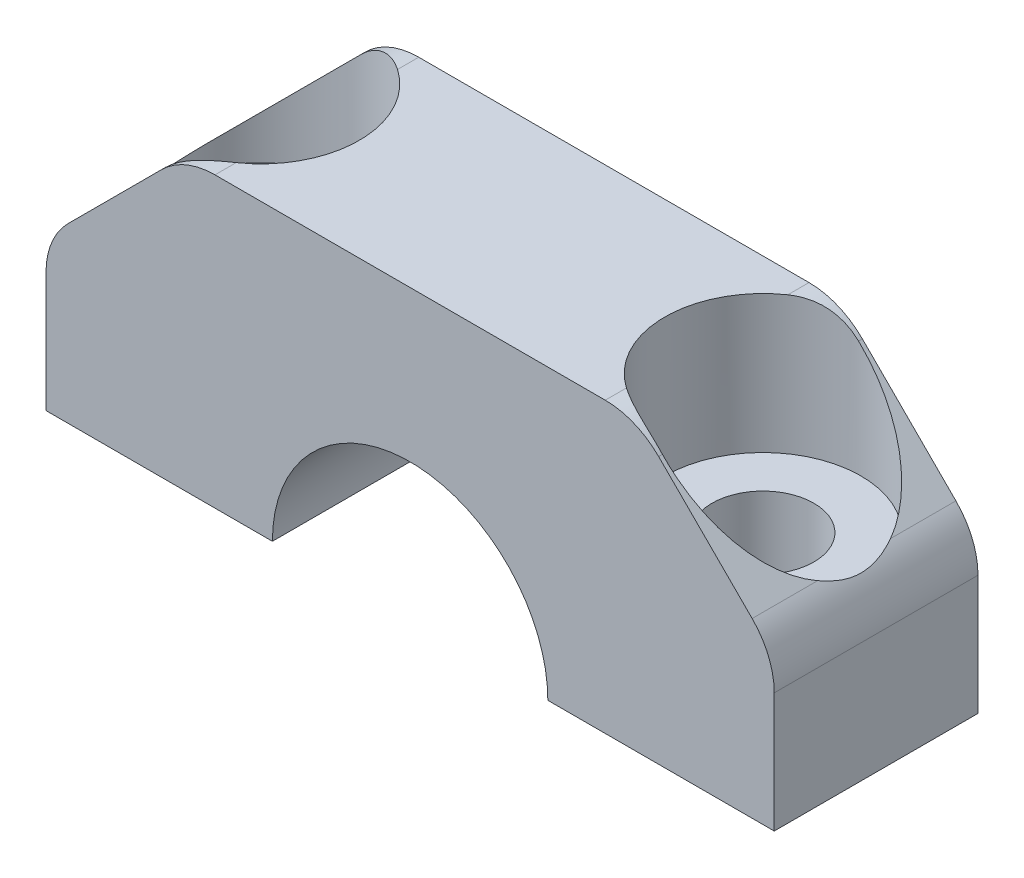
ISO-10303-21;
HEADER;
FILE_DESCRIPTION(('STEP AP214'),'2;1');
FILE_NAME('part.step','',(''),(''),'','','');
FILE_SCHEMA(('AUTOMOTIVE_DESIGN { 1 0 10303 214 1 1 1 1 }'));
ENDSEC;
DATA;
#1=APPLICATION_CONTEXT('core data for automotive mechanical design processes');
#2=APPLICATION_PROTOCOL_DEFINITION('international standard','automotive_design',2000,#1);
#3=PRODUCT_CONTEXT('',#1,'mechanical');
#4=PRODUCT('Part','Part','',(#3));
#5=PRODUCT_RELATED_PRODUCT_CATEGORY('part','',(#4));
#6=PRODUCT_DEFINITION_FORMATION('','',#4);
#7=PRODUCT_DEFINITION_CONTEXT('part definition',#1,'design');
#8=PRODUCT_DEFINITION('design','',#6,#7);
#9=PRODUCT_DEFINITION_SHAPE('','',#8);
#10=(LENGTH_UNIT() NAMED_UNIT(*) SI_UNIT(.MILLI.,.METRE.));
#11=(NAMED_UNIT(*) PLANE_ANGLE_UNIT() SI_UNIT($,.RADIAN.));
#12=(NAMED_UNIT(*) SI_UNIT($,.STERADIAN.) SOLID_ANGLE_UNIT());
#13=UNCERTAINTY_MEASURE_WITH_UNIT(LENGTH_MEASURE(1.E-05),#10,'distance_accuracy_value','');
#14=(GEOMETRIC_REPRESENTATION_CONTEXT(3) GLOBAL_UNCERTAINTY_ASSIGNED_CONTEXT((#13)) GLOBAL_UNIT_ASSIGNED_CONTEXT((#10,
#11,#12)) REPRESENTATION_CONTEXT('',''));
#15=CARTESIAN_POINT('',(0.,0.,0.));
#16=DIRECTION('',(0.,0.,1.));
#17=DIRECTION('',(1.,0.,0.));
#18=AXIS2_PLACEMENT_3D('',#15,#16,#17);
#19=CARTESIAN_POINT('',(-12.2555,5.08,0.));
#20=DIRECTION('',(0.707106781186551,-0.707106781186544,0.));
#21=DIRECTION('',(0.707106781186544,0.707106781186551,0.));
#22=AXIS2_PLACEMENT_3D('',#19,#20,#21);
#23=PLANE('',#22);
#24=DIRECTION('',(0.707106781186544,0.707106781186551,0.));
#25=VECTOR('',#24,1.);
#26=CARTESIAN_POINT('',(-12.2555,5.08,0.));
#27=LINE('',#26,#25);
#28=CARTESIAN_POINT('',(-11.5115512242138,5.82394877578617,0.));
#29=VERTEX_POINT('',#28);
#30=CARTESIAN_POINT('',(-8.36394877578622,8.97155122421382,0.));
#31=VERTEX_POINT('',#30);
#32=EDGE_CURVE('E395',#29,#31,#27,.T.);
#33=ORIENTED_EDGE('',*,*,#32,.F.);
#34=DIRECTION('',(0.,0.,1.));
#35=VECTOR('',#34,1.);
#36=CARTESIAN_POINT('',(-11.5115512242138,5.82394877578617,0.));
#37=LINE('',#36,#35);
#38=CARTESIAN_POINT('',(-11.5115512242138,5.82394877578617,2.20322110864283));
#39=VERTEX_POINT('',#38);
#40=EDGE_CURVE('E278',#29,#39,#37,.T.);
#41=ORIENTED_EDGE('',*,*,#40,.T.);
#42=CARTESIAN_POINT('',(-8.4455,8.89000000000004,3.429));
#43=DIRECTION('',(0.707106781186551,-0.707106781186544,0.));
#44=DIRECTION('',(-0.707106781186544,-0.707106781186551,0.));
#45=AXIS2_PLACEMENT_3D('',#42,#43,#44);
#46=ELLIPSE('',#45,4.66973318295598,3.302);
#47=CARTESIAN_POINT('',(-8.36394877578622,8.97155122421382,0.128007210273062));
#48=VERTEX_POINT('',#47);
#49=EDGE_CURVE('E197',#48,#39,#46,.F.);
#50=ORIENTED_EDGE('',*,*,#49,.F.);
#51=DIRECTION('',(0.,0.,1.));
#52=VECTOR('',#51,1.);
#53=CARTESIAN_POINT('',(-8.36394877578622,8.97155122421382,0.));
#54=LINE('',#53,#52);
#55=EDGE_CURVE('E437',#48,#31,#54,.F.);
#56=ORIENTED_EDGE('',*,*,#55,.T.);
#57=EDGE_LOOP('',(#33,#41,#50,#56));
#58=FACE_BOUND('',#57,.T.);
#59=ADVANCED_FACE('F37',(#58),#23,.F.);
#60=CARTESIAN_POINT('',(7.62000000000005,9.7155,0.));
#61=DIRECTION('',(-0.707106781186551,-0.707106781186544,0.));
#62=DIRECTION('',(0.707106781186544,-0.707106781186551,0.));
#63=AXIS2_PLACEMENT_3D('',#60,#61,#62);
#64=PLANE('',#63);
#65=DIRECTION('',(0.707106781186544,-0.707106781186551,0.));
#66=VECTOR('',#65,1.);
#67=CARTESIAN_POINT('',(7.62000000000005,9.7155,6.858));
#68=LINE('',#67,#66);
#69=CARTESIAN_POINT('',(8.36394877578622,8.97155122421382,6.858));
#70=VERTEX_POINT('',#69);
#71=CARTESIAN_POINT('',(11.5115512242138,5.82394877578617,6.858));
#72=VERTEX_POINT('',#71);
#73=EDGE_CURVE('E207',#70,#72,#68,.T.);
#74=ORIENTED_EDGE('',*,*,#73,.T.);
#75=DIRECTION('',(0.,0.,1.));
#76=VECTOR('',#75,1.);
#77=CARTESIAN_POINT('',(11.5115512242138,5.82394877578617,0.));
#78=LINE('',#77,#76);
#79=CARTESIAN_POINT('',(11.5115512242138,5.82394877578617,4.65477889135718));
#80=VERTEX_POINT('',#79);
#81=EDGE_CURVE('E292',#72,#80,#78,.F.);
#82=ORIENTED_EDGE('',*,*,#81,.T.);
#83=CARTESIAN_POINT('',(8.4455,8.89000000000003,3.429));
#84=DIRECTION('',(-0.707106781186551,-0.707106781186544,0.));
#85=DIRECTION('',(0.707106781186544,-0.707106781186551,0.));
#86=AXIS2_PLACEMENT_3D('',#83,#84,#85);
#87=ELLIPSE('',#86,4.66973318295599,3.302);
#88=CARTESIAN_POINT('',(8.36394877578622,8.97155122421382,6.72999278972694));
#89=VERTEX_POINT('',#88);
#90=EDGE_CURVE('E189',#89,#80,#87,.F.);
#91=ORIENTED_EDGE('',*,*,#90,.F.);
#92=DIRECTION('',(0.,0.,1.));
#93=VECTOR('',#92,1.);
#94=CARTESIAN_POINT('',(8.36394877578622,8.97155122421382,0.));
#95=LINE('',#94,#93);
#96=EDGE_CURVE('E199',#89,#70,#95,.T.);
#97=ORIENTED_EDGE('',*,*,#96,.T.);
#98=EDGE_LOOP('',(#74,#82,#91,#97));
#99=FACE_BOUND('',#98,.T.);
#100=ADVANCED_FACE('F305',(#99),#64,.F.);
#101=CARTESIAN_POINT('',(8.4455,9.7155,3.429));
#102=DIRECTION('',(0.,-1.,0.));
#103=DIRECTION('',(0.,0.,-1.));
#104=AXIS2_PLACEMENT_3D('',#101,#102,#103);
#105=CYLINDRICAL_SURFACE('',#104,1.7145);
#106=CARTESIAN_POINT('',(8.4455,0.,3.429));
#107=DIRECTION('',(0.,1.,0.));
#108=DIRECTION('',(0.,0.,1.));
#109=AXIS2_PLACEMENT_3D('',#106,#107,#108);
#110=CIRCLE('',#109,1.7145);
#111=CARTESIAN_POINT('',(8.4455,0.,1.7145));
#112=VERTEX_POINT('',#111);
#113=EDGE_CURVE('E392',#112,#112,#110,.T.);
#114=CARTESIAN_POINT('',(8.4455,5.08,3.429));
#115=DIRECTION('',(0.,1.,0.));
#116=DIRECTION('',(-1.,0.,0.));
#117=AXIS2_PLACEMENT_3D('',#114,#115,#116);
#118=CIRCLE('',#117,1.7145);
#119=CARTESIAN_POINT('',(8.4455,5.08,1.7145));
#120=VERTEX_POINT('',#119);
#121=EDGE_CURVE('E203',#120,#120,#118,.F.);
#122=CARTESIAN_POINT('',(8.4455,0.,1.7145));
#123=CARTESIAN_POINT('',(8.4455,0.0529166666666664,1.7145));
#124=CARTESIAN_POINT('',(8.4455,0.105833333333333,1.7145));
#125=CARTESIAN_POINT('',(8.4455,0.211666666666666,1.7145));
#126=CARTESIAN_POINT('',(8.4455,0.264583333333333,1.7145));
#127=CARTESIAN_POINT('',(8.4455,0.370416666666667,1.7145));
#128=CARTESIAN_POINT('',(8.4455,0.423333333333334,1.7145));
#129=CARTESIAN_POINT('',(8.4455,0.529166666666667,1.7145));
#130=CARTESIAN_POINT('',(8.4455,0.582083333333334,1.7145));
#131=CARTESIAN_POINT('',(8.4455,0.687916666666667,1.7145));
#132=CARTESIAN_POINT('',(8.4455,0.740833333333333,1.7145));
#133=CARTESIAN_POINT('',(8.4455,0.846666666666666,1.7145));
#134=CARTESIAN_POINT('',(8.4455,0.899583333333333,1.7145));
#135=CARTESIAN_POINT('',(8.4455,1.00541666666667,1.7145));
#136=CARTESIAN_POINT('',(8.4455,1.05833333333333,1.7145));
#137=CARTESIAN_POINT('',(8.4455,1.16416666666667,1.7145));
#138=CARTESIAN_POINT('',(8.4455,1.21708333333333,1.7145));
#139=CARTESIAN_POINT('',(8.4455,1.32291666666667,1.7145));
#140=CARTESIAN_POINT('',(8.4455,1.37583333333333,1.7145));
#141=CARTESIAN_POINT('',(8.4455,1.48166666666667,1.7145));
#142=CARTESIAN_POINT('',(8.4455,1.53458333333333,1.7145));
#143=CARTESIAN_POINT('',(8.4455,1.64041666666667,1.7145));
#144=CARTESIAN_POINT('',(8.4455,1.69333333333333,1.7145));
#145=CARTESIAN_POINT('',(8.4455,1.79916666666667,1.7145));
#146=CARTESIAN_POINT('',(8.4455,1.85208333333333,1.7145));
#147=CARTESIAN_POINT('',(8.4455,1.95791666666667,1.7145));
#148=CARTESIAN_POINT('',(8.4455,2.01083333333333,1.7145));
#149=CARTESIAN_POINT('',(8.4455,2.11666666666667,1.7145));
#150=CARTESIAN_POINT('',(8.4455,2.16958333333333,1.7145));
#151=CARTESIAN_POINT('',(8.4455,2.27541666666667,1.7145));
#152=CARTESIAN_POINT('',(8.4455,2.32833333333333,1.7145));
#153=CARTESIAN_POINT('',(8.4455,2.43416666666667,1.7145));
#154=CARTESIAN_POINT('',(8.4455,2.48708333333333,1.7145));
#155=CARTESIAN_POINT('',(8.4455,2.59291666666667,1.7145));
#156=CARTESIAN_POINT('',(8.4455,2.64583333333333,1.7145));
#157=CARTESIAN_POINT('',(8.4455,2.75166666666667,1.7145));
#158=CARTESIAN_POINT('',(8.4455,2.80458333333333,1.7145));
#159=CARTESIAN_POINT('',(8.4455,2.91041666666667,1.7145));
#160=CARTESIAN_POINT('',(8.4455,2.96333333333333,1.7145));
#161=CARTESIAN_POINT('',(8.4455,3.06916666666667,1.7145));
#162=CARTESIAN_POINT('',(8.4455,3.12208333333333,1.7145));
#163=CARTESIAN_POINT('',(8.4455,3.22791666666667,1.7145));
#164=CARTESIAN_POINT('',(8.4455,3.28083333333333,1.7145));
#165=CARTESIAN_POINT('',(8.4455,3.38666666666667,1.7145));
#166=CARTESIAN_POINT('',(8.4455,3.43958333333333,1.7145));
#167=CARTESIAN_POINT('',(8.4455,3.54541666666667,1.7145));
#168=CARTESIAN_POINT('',(8.4455,3.59833333333333,1.7145));
#169=CARTESIAN_POINT('',(8.4455,3.70416666666667,1.7145));
#170=CARTESIAN_POINT('',(8.4455,3.75708333333333,1.7145));
#171=CARTESIAN_POINT('',(8.4455,3.86291666666667,1.7145));
#172=CARTESIAN_POINT('',(8.4455,3.91583333333333,1.7145));
#173=CARTESIAN_POINT('',(8.4455,4.02166666666667,1.7145));
#174=CARTESIAN_POINT('',(8.4455,4.07458333333333,1.7145));
#175=CARTESIAN_POINT('',(8.4455,4.18041666666667,1.7145));
#176=CARTESIAN_POINT('',(8.4455,4.23333333333333,1.7145));
#177=CARTESIAN_POINT('',(8.4455,4.33916666666667,1.7145));
#178=CARTESIAN_POINT('',(8.4455,4.39208333333333,1.7145));
#179=CARTESIAN_POINT('',(8.4455,4.49791666666667,1.7145));
#180=CARTESIAN_POINT('',(8.4455,4.55083333333333,1.7145));
#181=CARTESIAN_POINT('',(8.4455,4.65666666666667,1.7145));
#182=CARTESIAN_POINT('',(8.4455,4.70958333333333,1.7145));
#183=CARTESIAN_POINT('',(8.4455,4.81541666666667,1.7145));
#184=CARTESIAN_POINT('',(8.4455,4.86833333333333,1.7145));
#185=CARTESIAN_POINT('',(8.4455,4.97416666666667,1.7145));
#186=CARTESIAN_POINT('',(8.4455,5.02708333333333,1.7145));
#187=CARTESIAN_POINT('',(8.4455,5.08,1.7145));
#188=B_SPLINE_CURVE_WITH_KNOTS('',3,(#122,#123,#124,#125,#126,#127,#128,#129,#130,#131,#132,
#133,#134,#135,#136,#137,#138,#139,#140,#141,#142,#143,#144,#145,#146,#147,#148,#149,#150,#151,
#152,#153,#154,#155,#156,#157,#158,#159,#160,#161,#162,#163,#164,#165,#166,#167,#168,#169,#170,
#171,#172,#173,#174,#175,#176,#177,#178,#179,#180,#181,#182,#183,#184,#185,#186,#187),
.UNSPECIFIED.,.F.,.F.,(4,2,2,2,2,2,2,2,2,2,2,2,2,2,2,2,2,2,2,2,2,2,2,2,2,2,2,2,2,2,2,2,4),(0.,
0.158749999999999,0.3175,0.476250000000001,0.635,0.793749999999999,0.9525,1.11125,1.27,1.42875,
1.5875,1.74625,1.905,2.06375,2.2225,2.38125,2.54,2.69875,2.8575,3.01625,3.175,3.33375,3.4925,
3.65125,3.81,3.96875,4.1275,4.28625,4.445,4.60375,4.7625,4.92125,5.08),.UNSPECIFIED.);
#189=EDGE_CURVE('BSEAM311',#112,#120,#188,.T.);
#190=ORIENTED_EDGE('',*,*,#113,.F.);
#191=ORIENTED_EDGE('',*,*,#121,.F.);
#192=ORIENTED_EDGE('',*,*,#189,.T.);
#193=ORIENTED_EDGE('',*,*,#189,.F.);
#194=EDGE_LOOP('',(#190,#192,#191,#193));
#195=FACE_BOUND('',#194,.T.);
#196=ADVANCED_FACE('F311',(#195),#105,.F.);
#197=CARTESIAN_POINT('',(-8.4455,9.7155,3.429));
#198=DIRECTION('',(0.,-1.,0.));
#199=DIRECTION('',(0.,0.,-1.));
#200=AXIS2_PLACEMENT_3D('',#197,#198,#199);
#201=CYLINDRICAL_SURFACE('',#200,1.7145);
#202=CARTESIAN_POINT('',(-8.4455,0.,3.429));
#203=DIRECTION('',(0.,1.,0.));
#204=DIRECTION('',(0.,0.,1.));
#205=AXIS2_PLACEMENT_3D('',#202,#203,#204);
#206=CIRCLE('',#205,1.7145);
#207=CARTESIAN_POINT('',(-8.4455,0.,1.7145));
#208=VERTEX_POINT('',#207);
#209=EDGE_CURVE('E383',#208,#208,#206,.T.);
#210=CARTESIAN_POINT('',(-8.4455,5.08,3.429));
#211=DIRECTION('',(0.,1.,0.));
#212=DIRECTION('',(-1.,0.,0.));
#213=AXIS2_PLACEMENT_3D('',#210,#211,#212);
#214=CIRCLE('',#213,1.7145);
#215=CARTESIAN_POINT('',(-8.4455,5.08,1.7145));
#216=VERTEX_POINT('',#215);
#217=EDGE_CURVE('E200',#216,#216,#214,.F.);
#218=CARTESIAN_POINT('',(-8.4455,0.,1.7145));
#219=CARTESIAN_POINT('',(-8.4455,0.0529166666666664,1.7145));
#220=CARTESIAN_POINT('',(-8.4455,0.105833333333333,1.7145));
#221=CARTESIAN_POINT('',(-8.4455,0.211666666666666,1.7145));
#222=CARTESIAN_POINT('',(-8.4455,0.264583333333333,1.7145));
#223=CARTESIAN_POINT('',(-8.4455,0.370416666666666,1.7145));
#224=CARTESIAN_POINT('',(-8.4455,0.423333333333333,1.7145));
#225=CARTESIAN_POINT('',(-8.4455,0.529166666666666,1.7145));
#226=CARTESIAN_POINT('',(-8.4455,0.582083333333333,1.7145));
#227=CARTESIAN_POINT('',(-8.4455,0.687916666666667,1.7145));
#228=CARTESIAN_POINT('',(-8.4455,0.740833333333333,1.7145));
#229=CARTESIAN_POINT('',(-8.4455,0.846666666666666,1.7145));
#230=CARTESIAN_POINT('',(-8.4455,0.899583333333333,1.7145));
#231=CARTESIAN_POINT('',(-8.4455,1.00541666666667,1.7145));
#232=CARTESIAN_POINT('',(-8.4455,1.05833333333333,1.7145));
#233=CARTESIAN_POINT('',(-8.4455,1.16416666666667,1.7145));
#234=CARTESIAN_POINT('',(-8.4455,1.21708333333333,1.7145));
#235=CARTESIAN_POINT('',(-8.4455,1.32291666666667,1.7145));
#236=CARTESIAN_POINT('',(-8.4455,1.37583333333333,1.7145));
#237=CARTESIAN_POINT('',(-8.4455,1.48166666666667,1.7145));
#238=CARTESIAN_POINT('',(-8.4455,1.53458333333333,1.7145));
#239=CARTESIAN_POINT('',(-8.4455,1.64041666666667,1.7145));
#240=CARTESIAN_POINT('',(-8.4455,1.69333333333333,1.7145));
#241=CARTESIAN_POINT('',(-8.4455,1.79916666666667,1.7145));
#242=CARTESIAN_POINT('',(-8.4455,1.85208333333333,1.7145));
#243=CARTESIAN_POINT('',(-8.4455,1.95791666666667,1.7145));
#244=CARTESIAN_POINT('',(-8.4455,2.01083333333333,1.7145));
#245=CARTESIAN_POINT('',(-8.4455,2.11666666666667,1.7145));
#246=CARTESIAN_POINT('',(-8.4455,2.16958333333333,1.7145));
#247=CARTESIAN_POINT('',(-8.4455,2.27541666666667,1.7145));
#248=CARTESIAN_POINT('',(-8.4455,2.32833333333333,1.7145));
#249=CARTESIAN_POINT('',(-8.4455,2.43416666666667,1.7145));
#250=CARTESIAN_POINT('',(-8.4455,2.48708333333333,1.7145));
#251=CARTESIAN_POINT('',(-8.4455,2.59291666666667,1.7145));
#252=CARTESIAN_POINT('',(-8.4455,2.64583333333333,1.7145));
#253=CARTESIAN_POINT('',(-8.4455,2.75166666666667,1.7145));
#254=CARTESIAN_POINT('',(-8.4455,2.80458333333333,1.7145));
#255=CARTESIAN_POINT('',(-8.4455,2.91041666666667,1.7145));
#256=CARTESIAN_POINT('',(-8.4455,2.96333333333333,1.7145));
#257=CARTESIAN_POINT('',(-8.4455,3.06916666666667,1.7145));
#258=CARTESIAN_POINT('',(-8.4455,3.12208333333333,1.7145));
#259=CARTESIAN_POINT('',(-8.4455,3.22791666666667,1.7145));
#260=CARTESIAN_POINT('',(-8.4455,3.28083333333333,1.7145));
#261=CARTESIAN_POINT('',(-8.4455,3.38666666666667,1.7145));
#262=CARTESIAN_POINT('',(-8.4455,3.43958333333333,1.7145));
#263=CARTESIAN_POINT('',(-8.4455,3.54541666666666,1.7145));
#264=CARTESIAN_POINT('',(-8.4455,3.59833333333333,1.7145));
#265=CARTESIAN_POINT('',(-8.4455,3.70416666666667,1.7145));
#266=CARTESIAN_POINT('',(-8.4455,3.75708333333333,1.7145));
#267=CARTESIAN_POINT('',(-8.4455,3.86291666666667,1.7145));
#268=CARTESIAN_POINT('',(-8.4455,3.91583333333333,1.7145));
#269=CARTESIAN_POINT('',(-8.4455,4.02166666666666,1.7145));
#270=CARTESIAN_POINT('',(-8.4455,4.07458333333333,1.7145));
#271=CARTESIAN_POINT('',(-8.4455,4.18041666666667,1.7145));
#272=CARTESIAN_POINT('',(-8.4455,4.23333333333333,1.7145));
#273=CARTESIAN_POINT('',(-8.4455,4.33916666666666,1.7145));
#274=CARTESIAN_POINT('',(-8.4455,4.39208333333333,1.7145));
#275=CARTESIAN_POINT('',(-8.4455,4.49791666666667,1.7145));
#276=CARTESIAN_POINT('',(-8.4455,4.55083333333333,1.7145));
#277=CARTESIAN_POINT('',(-8.4455,4.65666666666666,1.7145));
#278=CARTESIAN_POINT('',(-8.4455,4.70958333333333,1.7145));
#279=CARTESIAN_POINT('',(-8.4455,4.81541666666666,1.7145));
#280=CARTESIAN_POINT('',(-8.4455,4.86833333333333,1.7145));
#281=CARTESIAN_POINT('',(-8.4455,4.97416666666667,1.7145));
#282=CARTESIAN_POINT('',(-8.4455,5.02708333333333,1.7145));
#283=CARTESIAN_POINT('',(-8.4455,5.08,1.7145));
#284=B_SPLINE_CURVE_WITH_KNOTS('',3,(#218,#219,#220,#221,#222,#223,#224,#225,#226,#227,#228,
#229,#230,#231,#232,#233,#234,#235,#236,#237,#238,#239,#240,#241,#242,#243,#244,#245,#246,#247,
#248,#249,#250,#251,#252,#253,#254,#255,#256,#257,#258,#259,#260,#261,#262,#263,#264,#265,#266,
#267,#268,#269,#270,#271,#272,#273,#274,#275,#276,#277,#278,#279,#280,#281,#282,#283),
.UNSPECIFIED.,.F.,.F.,(4,2,2,2,2,2,2,2,2,2,2,2,2,2,2,2,2,2,2,2,2,2,2,2,2,2,2,2,2,2,2,2,4),(0.,
0.158749999999999,0.3175,0.476249999999999,0.635,0.793749999999999,0.9525,1.11125,1.27,1.42875,
1.5875,1.74625,1.905,2.06375,2.2225,2.38125,2.54,2.69875,2.8575,3.01625,3.175,3.33375,3.4925,
3.65125,3.81,3.96875,4.1275,4.28625,4.445,4.60375,4.7625,4.92125,5.08),.UNSPECIFIED.);
#285=EDGE_CURVE('BSEAM317',#208,#216,#284,.T.);
#286=ORIENTED_EDGE('',*,*,#209,.F.);
#287=ORIENTED_EDGE('',*,*,#217,.F.);
#288=ORIENTED_EDGE('',*,*,#285,.T.);
#289=ORIENTED_EDGE('',*,*,#285,.F.);
#290=EDGE_LOOP('',(#286,#288,#287,#289));
#291=FACE_BOUND('',#290,.T.);
#292=ADVANCED_FACE('F317',(#291),#201,.F.);
#293=CARTESIAN_POINT('',(-11.5115512242138,5.82394877578617,4.65477889135717));
#294=VERTEX_POINT('',#293);
#295=CARTESIAN_POINT('',(-8.36394877578622,8.97155122421382,6.72999278972694));
#296=VERTEX_POINT('',#295);
#297=EDGE_CURVE('E196',#294,#296,#46,.F.);
#298=ORIENTED_EDGE('',*,*,#297,.F.);
#299=DIRECTION('',(0.,0.,1.));
#300=VECTOR('',#299,1.);
#301=CARTESIAN_POINT('',(-11.5115512242138,5.82394877578617,0.));
#302=LINE('',#301,#300);
#303=CARTESIAN_POINT('',(-11.5115512242138,5.82394877578617,6.858));
#304=VERTEX_POINT('',#303);
#305=EDGE_CURVE('E280',#294,#304,#302,.T.);
#306=ORIENTED_EDGE('',*,*,#305,.T.);
#307=DIRECTION('',(0.707106781186544,0.707106781186551,0.));
#308=VECTOR('',#307,1.);
#309=CARTESIAN_POINT('',(-12.2555,5.08,6.858));
#310=LINE('',#309,#308);
#311=CARTESIAN_POINT('',(-8.36394877578622,8.97155122421382,6.858));
#312=VERTEX_POINT('',#311);
#313=EDGE_CURVE('E398',#304,#312,#310,.T.);
#314=ORIENTED_EDGE('',*,*,#313,.T.);
#315=DIRECTION('',(0.,0.,1.));
#316=VECTOR('',#315,1.);
#317=CARTESIAN_POINT('',(-8.36394877578622,8.97155122421382,0.));
#318=LINE('',#317,#316);
#319=EDGE_CURVE('E328',#312,#296,#318,.F.);
#320=ORIENTED_EDGE('',*,*,#319,.T.);
#321=EDGE_LOOP('',(#298,#306,#314,#320));
#322=FACE_BOUND('',#321,.T.);
#323=ADVANCED_FACE('F307',(#322),#23,.F.);
#324=CARTESIAN_POINT('',(11.5115512242138,5.82394877578617,2.20322110864282));
#325=VERTEX_POINT('',#324);
#326=CARTESIAN_POINT('',(8.36394877578622,8.97155122421382,0.128007210273062));
#327=VERTEX_POINT('',#326);
#328=EDGE_CURVE('E187',#325,#327,#87,.F.);
#329=ORIENTED_EDGE('',*,*,#328,.F.);
#330=DIRECTION('',(0.,0.,1.));
#331=VECTOR('',#330,1.);
#332=CARTESIAN_POINT('',(11.5115512242138,5.82394877578617,0.));
#333=LINE('',#332,#331);
#334=CARTESIAN_POINT('',(11.5115512242138,5.82394877578617,0.));
#335=VERTEX_POINT('',#334);
#336=EDGE_CURVE('E332',#325,#335,#333,.F.);
#337=ORIENTED_EDGE('',*,*,#336,.T.);
#338=DIRECTION('',(0.707106781186544,-0.707106781186551,0.));
#339=VECTOR('',#338,1.);
#340=CARTESIAN_POINT('',(7.62000000000005,9.7155,0.));
#341=LINE('',#340,#339);
#342=CARTESIAN_POINT('',(8.36394877578622,8.97155122421382,0.));
#343=VERTEX_POINT('',#342);
#344=EDGE_CURVE('E355',#343,#335,#341,.T.);
#345=ORIENTED_EDGE('',*,*,#344,.F.);
#346=DIRECTION('',(0.,0.,1.));
#347=VECTOR('',#346,1.);
#348=CARTESIAN_POINT('',(8.36394877578622,8.97155122421382,0.));
#349=LINE('',#348,#347);
#350=EDGE_CURVE('E210',#343,#327,#349,.T.);
#351=ORIENTED_EDGE('',*,*,#350,.T.);
#352=EDGE_LOOP('',(#329,#337,#345,#351));
#353=FACE_BOUND('',#352,.T.);
#354=ADVANCED_FACE('F314',(#353),#64,.F.);
#355=CARTESIAN_POINT('',(-12.2555,9.7155,6.858));
#356=DIRECTION('',(1.,0.,0.));
#357=DIRECTION('',(0.,1.,0.));
#358=AXIS2_PLACEMENT_3D('',#355,#356,#357);
#359=PLANE('',#358);
#360=DIRECTION('',(0.,-1.,0.));
#361=VECTOR('',#360,1.);
#362=CARTESIAN_POINT('',(-12.2555,9.7155,6.858));
#363=LINE('',#362,#361);
#364=CARTESIAN_POINT('',(-12.2555,4.02789755157235,6.858));
#365=VERTEX_POINT('',#364);
#366=CARTESIAN_POINT('',(-12.2555,0.,6.858));
#367=VERTEX_POINT('',#366);
#368=EDGE_CURVE('E160',#365,#367,#363,.T.);
#369=ORIENTED_EDGE('',*,*,#368,.F.);
#370=DIRECTION('',(0.,0.,1.));
#371=VECTOR('',#370,1.);
#372=CARTESIAN_POINT('',(-12.2555,4.02789755157235,6.858));
#373=LINE('',#372,#371);
#374=CARTESIAN_POINT('',(-12.2555,4.02789755157235,0.));
#375=VERTEX_POINT('',#374);
#376=EDGE_CURVE('E11',#365,#375,#373,.F.);
#377=ORIENTED_EDGE('',*,*,#376,.T.);
#378=DIRECTION('',(0.,-1.,0.));
#379=VECTOR('',#378,1.);
#380=CARTESIAN_POINT('',(-12.2555,9.7155,0.));
#381=LINE('',#380,#379);
#382=CARTESIAN_POINT('',(-12.2555,0.,0.));
#383=VERTEX_POINT('',#382);
#384=EDGE_CURVE('E185',#375,#383,#381,.T.);
#385=ORIENTED_EDGE('',*,*,#384,.T.);
#386=DIRECTION('',(0.,0.,-1.));
#387=VECTOR('',#386,1.);
#388=CARTESIAN_POINT('',(-12.2555,0.,6.858));
#389=LINE('',#388,#387);
#390=EDGE_CURVE('E177',#367,#383,#389,.T.);
#391=ORIENTED_EDGE('',*,*,#390,.F.);
#392=EDGE_LOOP('',(#369,#377,#385,#391));
#393=FACE_BOUND('',#392,.T.);
#394=ADVANCED_FACE('F183',(#393),#359,.F.);
#395=CARTESIAN_POINT('',(-12.2555,0.,6.858));
#396=DIRECTION('',(0.,1.,0.));
#397=DIRECTION('',(0.,0.,1.));
#398=AXIS2_PLACEMENT_3D('',#395,#396,#397);
#399=PLANE('',#398);
#400=ORIENTED_EDGE('',*,*,#209,.T.);
#401=EDGE_LOOP('',(#400));
#402=FACE_BOUND('',#401,.T.);
#403=DIRECTION('',(1.,0.,0.));
#404=VECTOR('',#403,1.);
#405=CARTESIAN_POINT('',(-12.2555,0.,0.));
#406=LINE('',#405,#404);
#407=CARTESIAN_POINT('',(-4.6355,0.,0.));
#408=VERTEX_POINT('',#407);
#409=EDGE_CURVE('E379',#383,#408,#406,.T.);
#410=ORIENTED_EDGE('',*,*,#409,.T.);
#411=DIRECTION('',(0.,0.,-1.));
#412=VECTOR('',#411,1.);
#413=CARTESIAN_POINT('',(-4.6355,0.,6.858));
#414=LINE('',#413,#412);
#415=CARTESIAN_POINT('',(-4.6355,0.,6.858));
#416=VERTEX_POINT('',#415);
#417=EDGE_CURVE('E179',#416,#408,#414,.T.);
#418=ORIENTED_EDGE('',*,*,#417,.F.);
#419=DIRECTION('',(1.,0.,0.));
#420=VECTOR('',#419,1.);
#421=CARTESIAN_POINT('',(-12.2555,0.,6.858));
#422=LINE('',#421,#420);
#423=EDGE_CURVE('E164',#367,#416,#422,.T.);
#424=ORIENTED_EDGE('',*,*,#423,.F.);
#425=ORIENTED_EDGE('',*,*,#390,.T.);
#426=EDGE_LOOP('',(#410,#418,#424,#425));
#427=FACE_BOUND('',#426,.T.);
#428=ADVANCED_FACE('F176',(#402,#427),#399,.F.);
#429=CARTESIAN_POINT('',(0.,0.,6.858));
#430=DIRECTION('',(0.,0.,-1.));
#431=DIRECTION('',(-1.,0.,0.));
#432=AXIS2_PLACEMENT_3D('',#429,#430,#431);
#433=CYLINDRICAL_SURFACE('',#432,4.6355);
#434=CARTESIAN_POINT('',(0.,0.,0.));
#435=DIRECTION('',(0.,0.,-1.));
#436=DIRECTION('',(1.,0.,0.));
#437=AXIS2_PLACEMENT_3D('',#434,#435,#436);
#438=CIRCLE('',#437,4.6355);
#439=CARTESIAN_POINT('',(4.6355,0.,0.));
#440=VERTEX_POINT('',#439);
#441=EDGE_CURVE('E366',#408,#440,#438,.T.);
#442=ORIENTED_EDGE('',*,*,#441,.T.);
#443=DIRECTION('',(0.,0.,-1.));
#444=VECTOR('',#443,1.);
#445=CARTESIAN_POINT('',(4.6355,0.,6.858));
#446=LINE('',#445,#444);
#447=CARTESIAN_POINT('',(4.6355,0.,6.858));
#448=VERTEX_POINT('',#447);
#449=EDGE_CURVE('E191',#448,#440,#446,.T.);
#450=ORIENTED_EDGE('',*,*,#449,.F.);
#451=CARTESIAN_POINT('',(0.,0.,6.858));
#452=DIRECTION('',(0.,0.,-1.));
#453=DIRECTION('',(1.,0.,0.));
#454=AXIS2_PLACEMENT_3D('',#451,#452,#453);
#455=CIRCLE('',#454,4.6355);
#456=EDGE_CURVE('E181',#416,#448,#455,.T.);
#457=ORIENTED_EDGE('',*,*,#456,.F.);
#458=ORIENTED_EDGE('',*,*,#417,.T.);
#459=EDGE_LOOP('',(#442,#450,#457,#458));
#460=FACE_BOUND('',#459,.T.);
#461=ADVANCED_FACE('F448',(#460),#433,.F.);
#462=CARTESIAN_POINT('',(12.2555,0.,6.858));
#463=DIRECTION('',(0.,1.,0.));
#464=DIRECTION('',(0.,0.,1.));
#465=AXIS2_PLACEMENT_3D('',#462,#463,#464);
#466=PLANE('',#465);
#467=ORIENTED_EDGE('',*,*,#113,.T.);
#468=EDGE_LOOP('',(#467));
#469=FACE_BOUND('',#468,.T.);
#470=DIRECTION('',(1.,0.,0.));
#471=VECTOR('',#470,1.);
#472=CARTESIAN_POINT('',(12.2555,0.,0.));
#473=LINE('',#472,#471);
#474=CARTESIAN_POINT('',(12.2555,0.,0.));
#475=VERTEX_POINT('',#474);
#476=EDGE_CURVE('E362',#440,#475,#473,.T.);
#477=ORIENTED_EDGE('',*,*,#476,.T.);
#478=DIRECTION('',(0.,0.,-1.));
#479=VECTOR('',#478,1.);
#480=CARTESIAN_POINT('',(12.2555,0.,6.858));
#481=LINE('',#480,#479);
#482=CARTESIAN_POINT('',(12.2555,0.,6.858));
#483=VERTEX_POINT('',#482);
#484=EDGE_CURVE('E361',#483,#475,#481,.T.);
#485=ORIENTED_EDGE('',*,*,#484,.F.);
#486=DIRECTION('',(1.,0.,0.));
#487=VECTOR('',#486,1.);
#488=CARTESIAN_POINT('',(12.2555,0.,6.858));
#489=LINE('',#488,#487);
#490=EDGE_CURVE('E376',#448,#483,#489,.T.);
#491=ORIENTED_EDGE('',*,*,#490,.F.);
#492=ORIENTED_EDGE('',*,*,#449,.T.);
#493=EDGE_LOOP('',(#477,#485,#491,#492));
#494=FACE_BOUND('',#493,.T.);
#495=ADVANCED_FACE('F375',(#469,#494),#466,.F.);
#496=CARTESIAN_POINT('',(12.2555,9.7155,6.858));
#497=DIRECTION('',(-1.,0.,0.));
#498=DIRECTION('',(0.,-1.,0.));
#499=AXIS2_PLACEMENT_3D('',#496,#497,#498);
#500=PLANE('',#499);
#501=DIRECTION('',(0.,1.,0.));
#502=VECTOR('',#501,1.);
#503=CARTESIAN_POINT('',(12.2555,9.7155,0.));
#504=LINE('',#503,#502);
#505=CARTESIAN_POINT('',(12.2555,4.02789755157235,0.));
#506=VERTEX_POINT('',#505);
#507=EDGE_CURVE('E354',#475,#506,#504,.T.);
#508=ORIENTED_EDGE('',*,*,#507,.T.);
#509=DIRECTION('',(0.,0.,1.));
#510=VECTOR('',#509,1.);
#511=CARTESIAN_POINT('',(12.2555,4.02789755157235,6.858));
#512=LINE('',#511,#510);
#513=CARTESIAN_POINT('',(12.2555,4.02789755157235,6.858));
#514=VERTEX_POINT('',#513);
#515=EDGE_CURVE('E256',#506,#514,#512,.T.);
#516=ORIENTED_EDGE('',*,*,#515,.T.);
#517=DIRECTION('',(0.,1.,0.));
#518=VECTOR('',#517,1.);
#519=CARTESIAN_POINT('',(12.2555,9.7155,6.858));
#520=LINE('',#519,#518);
#521=EDGE_CURVE('E386',#483,#514,#520,.T.);
#522=ORIENTED_EDGE('',*,*,#521,.F.);
#523=ORIENTED_EDGE('',*,*,#484,.T.);
#524=EDGE_LOOP('',(#508,#516,#522,#523));
#525=FACE_BOUND('',#524,.T.);
#526=ADVANCED_FACE('F358',(#525),#500,.F.);
#527=CARTESIAN_POINT('',(-12.2555,9.7155,6.858));
#528=DIRECTION('',(0.,-1.,0.));
#529=DIRECTION('',(0.,0.,-1.));
#530=AXIS2_PLACEMENT_3D('',#527,#528,#529);
#531=PLANE('',#530);
#532=CARTESIAN_POINT('',(8.4455,9.71550000000001,3.429));
#533=DIRECTION('',(0.,1.,0.));
#534=DIRECTION('',(-1.,0.,0.));
#535=AXIS2_PLACEMENT_3D('',#532,#533,#534);
#536=CIRCLE('',#535,3.302);
#537=CARTESIAN_POINT('',(6.56789755157238,9.71550000000001,0.71278700289197));
#538=VERTEX_POINT('',#537);
#539=CARTESIAN_POINT('',(6.56789755157238,9.71550000000001,6.14521299710803));
#540=VERTEX_POINT('',#539);
#541=EDGE_CURVE('E404',#538,#540,#536,.T.);
#542=ORIENTED_EDGE('',*,*,#541,.F.);
#543=DIRECTION('',(0.,0.,1.));
#544=VECTOR('',#543,1.);
#545=CARTESIAN_POINT('',(6.56789755157238,9.7155,6.858));
#546=LINE('',#545,#544);
#547=CARTESIAN_POINT('',(6.56789755157237,9.7155,0.));
#548=VERTEX_POINT('',#547);
#549=EDGE_CURVE('E426',#538,#548,#546,.F.);
#550=ORIENTED_EDGE('',*,*,#549,.T.);
#551=DIRECTION('',(-1.,0.,0.));
#552=VECTOR('',#551,1.);
#553=CARTESIAN_POINT('',(-12.2555,9.7155,0.));
#554=LINE('',#553,#552);
#555=CARTESIAN_POINT('',(-6.56789755157238,9.7155,0.));
#556=VERTEX_POINT('',#555);
#557=EDGE_CURVE('E172',#548,#556,#554,.T.);
#558=ORIENTED_EDGE('',*,*,#557,.T.);
#559=DIRECTION('',(0.,0.,1.));
#560=VECTOR('',#559,1.);
#561=CARTESIAN_POINT('',(-6.56789755157238,9.7155,6.858));
#562=LINE('',#561,#560);
#563=CARTESIAN_POINT('',(-6.56789755157238,9.7155,0.712787002891967));
#564=VERTEX_POINT('',#563);
#565=EDGE_CURVE('E421',#556,#564,#562,.T.);
#566=ORIENTED_EDGE('',*,*,#565,.T.);
#567=CARTESIAN_POINT('',(-8.4455,9.7155,3.429));
#568=DIRECTION('',(0.,1.,0.));
#569=DIRECTION('',(-1.,0.,0.));
#570=AXIS2_PLACEMENT_3D('',#567,#568,#569);
#571=CIRCLE('',#570,3.302);
#572=CARTESIAN_POINT('',(-6.56789755157238,9.7155,6.14521299710803));
#573=VERTEX_POINT('',#572);
#574=EDGE_CURVE('E204',#573,#564,#571,.T.);
#575=ORIENTED_EDGE('',*,*,#574,.F.);
#576=DIRECTION('',(0.,0.,1.));
#577=VECTOR('',#576,1.);
#578=CARTESIAN_POINT('',(-6.56789755157238,9.7155,6.858));
#579=LINE('',#578,#577);
#580=CARTESIAN_POINT('',(-6.56789755157238,9.7155,6.858));
#581=VERTEX_POINT('',#580);
#582=EDGE_CURVE('E419',#573,#581,#579,.T.);
#583=ORIENTED_EDGE('',*,*,#582,.T.);
#584=DIRECTION('',(-1.,0.,0.));
#585=VECTOR('',#584,1.);
#586=CARTESIAN_POINT('',(-12.2555,9.7155,6.858));
#587=LINE('',#586,#585);
#588=CARTESIAN_POINT('',(6.56789755157237,9.7155,6.858));
#589=VERTEX_POINT('',#588);
#590=EDGE_CURVE('E370',#589,#581,#587,.T.);
#591=ORIENTED_EDGE('',*,*,#590,.F.);
#592=DIRECTION('',(0.,0.,1.));
#593=VECTOR('',#592,1.);
#594=CARTESIAN_POINT('',(6.56789755157238,9.7155,6.858));
#595=LINE('',#594,#593);
#596=EDGE_CURVE('E424',#589,#540,#595,.F.);
#597=ORIENTED_EDGE('',*,*,#596,.T.);
#598=EDGE_LOOP('',(#542,#550,#558,#566,#575,#583,#591,#597));
#599=FACE_BOUND('',#598,.T.);
#600=ADVANCED_FACE('F417',(#599),#531,.F.);
#601=CARTESIAN_POINT('',(0.,0.,6.858));
#602=DIRECTION('',(0.,0.,1.));
#603=DIRECTION('',(1.,0.,0.));
#604=AXIS2_PLACEMENT_3D('',#601,#602,#603);
#605=PLANE('',#604);
#606=ORIENTED_EDGE('',*,*,#521,.T.);
#607=CARTESIAN_POINT('',(9.7155,4.02789755157235,6.858));
#608=DIRECTION('',(0.,0.,1.));
#609=DIRECTION('',(1.,0.,0.));
#610=AXIS2_PLACEMENT_3D('',#607,#608,#609);
#611=CIRCLE('',#610,2.54);
#612=EDGE_CURVE('E331',#514,#72,#611,.T.);
#613=ORIENTED_EDGE('',*,*,#612,.T.);
#614=ORIENTED_EDGE('',*,*,#73,.F.);
#615=CARTESIAN_POINT('',(6.56789755157238,7.1755,6.858));
#616=DIRECTION('',(0.,0.,1.));
#617=DIRECTION('',(1.,0.,0.));
#618=AXIS2_PLACEMENT_3D('',#615,#616,#617);
#619=CIRCLE('',#618,2.54);
#620=EDGE_CURVE('E435',#70,#589,#619,.T.);
#621=ORIENTED_EDGE('',*,*,#620,.T.);
#622=ORIENTED_EDGE('',*,*,#590,.T.);
#623=CARTESIAN_POINT('',(-6.56789755157238,7.1755,6.858));
#624=DIRECTION('',(0.,0.,1.));
#625=DIRECTION('',(1.,0.,0.));
#626=AXIS2_PLACEMENT_3D('',#623,#624,#625);
#627=CIRCLE('',#626,2.54);
#628=EDGE_CURVE('E423',#581,#312,#627,.T.);
#629=ORIENTED_EDGE('',*,*,#628,.T.);
#630=ORIENTED_EDGE('',*,*,#313,.F.);
#631=CARTESIAN_POINT('',(-9.7155,4.02789755157235,6.858));
#632=DIRECTION('',(0.,0.,1.));
#633=DIRECTION('',(1.,0.,0.));
#634=AXIS2_PLACEMENT_3D('',#631,#632,#633);
#635=CIRCLE('',#634,2.54);
#636=EDGE_CURVE('E168',#304,#365,#635,.T.);
#637=ORIENTED_EDGE('',*,*,#636,.T.);
#638=ORIENTED_EDGE('',*,*,#368,.T.);
#639=ORIENTED_EDGE('',*,*,#423,.T.);
#640=ORIENTED_EDGE('',*,*,#456,.T.);
#641=ORIENTED_EDGE('',*,*,#490,.T.);
#642=EDGE_LOOP('',(#606,#613,#614,#621,#622,#629,#630,#637,#638,#639,#640,#641));
#643=FACE_BOUND('',#642,.T.);
#644=ADVANCED_FACE('F163',(#643),#605,.T.);
#645=CARTESIAN_POINT('',(0.,0.,0.));
#646=DIRECTION('',(0.,0.,1.));
#647=DIRECTION('',(1.,0.,0.));
#648=AXIS2_PLACEMENT_3D('',#645,#646,#647);
#649=PLANE('',#648);
#650=ORIENTED_EDGE('',*,*,#344,.T.);
#651=CARTESIAN_POINT('',(9.7155,4.02789755157235,0.));
#652=DIRECTION('',(0.,0.,1.));
#653=DIRECTION('',(1.,0.,0.));
#654=AXIS2_PLACEMENT_3D('',#651,#652,#653);
#655=CIRCLE('',#654,2.54);
#656=EDGE_CURVE('E282',#335,#506,#655,.F.);
#657=ORIENTED_EDGE('',*,*,#656,.T.);
#658=ORIENTED_EDGE('',*,*,#507,.F.);
#659=ORIENTED_EDGE('',*,*,#476,.F.);
#660=ORIENTED_EDGE('',*,*,#441,.F.);
#661=ORIENTED_EDGE('',*,*,#409,.F.);
#662=ORIENTED_EDGE('',*,*,#384,.F.);
#663=CARTESIAN_POINT('',(-9.7155,4.02789755157235,0.));
#664=DIRECTION('',(0.,0.,1.));
#665=DIRECTION('',(1.,0.,0.));
#666=AXIS2_PLACEMENT_3D('',#663,#664,#665);
#667=CIRCLE('',#666,2.54);
#668=EDGE_CURVE('E284',#375,#29,#667,.F.);
#669=ORIENTED_EDGE('',*,*,#668,.T.);
#670=ORIENTED_EDGE('',*,*,#32,.T.);
#671=CARTESIAN_POINT('',(-6.56789755157238,7.1755,0.));
#672=DIRECTION('',(0.,0.,1.));
#673=DIRECTION('',(1.,0.,0.));
#674=AXIS2_PLACEMENT_3D('',#671,#672,#673);
#675=CIRCLE('',#674,2.54);
#676=EDGE_CURVE('E430',#31,#556,#675,.F.);
#677=ORIENTED_EDGE('',*,*,#676,.T.);
#678=ORIENTED_EDGE('',*,*,#557,.F.);
#679=CARTESIAN_POINT('',(6.56789755157238,7.1755,0.));
#680=DIRECTION('',(0.,0.,1.));
#681=DIRECTION('',(1.,0.,0.));
#682=AXIS2_PLACEMENT_3D('',#679,#680,#681);
#683=CIRCLE('',#682,2.54);
#684=EDGE_CURVE('E432',#548,#343,#683,.F.);
#685=ORIENTED_EDGE('',*,*,#684,.T.);
#686=EDGE_LOOP('',(#650,#657,#658,#659,#660,#661,#662,#669,#670,#677,#678,#685));
#687=FACE_BOUND('',#686,.T.);
#688=ADVANCED_FACE('F352',(#687),#649,.F.);
#689=CARTESIAN_POINT('',(8.4455,5.08,3.429));
#690=DIRECTION('',(0.,1.,0.));
#691=DIRECTION('',(-1.,0.,0.));
#692=AXIS2_PLACEMENT_3D('',#689,#690,#691);
#693=PLANE('',#692);
#694=CARTESIAN_POINT('',(8.4455,5.08,3.429));
#695=DIRECTION('',(0.,1.,0.));
#696=DIRECTION('',(-1.,0.,0.));
#697=AXIS2_PLACEMENT_3D('',#694,#695,#696);
#698=CIRCLE('',#697,3.302);
#699=CARTESIAN_POINT('',(5.1435,5.08,3.429));
#700=VERTEX_POINT('',#699);
#701=EDGE_CURVE('E401',#700,#700,#698,.T.);
#702=ORIENTED_EDGE('',*,*,#701,.T.);
#703=EDGE_LOOP('',(#702));
#704=FACE_BOUND('',#703,.T.);
#705=ORIENTED_EDGE('',*,*,#121,.T.);
#706=EDGE_LOOP('',(#705));
#707=FACE_BOUND('',#706,.T.);
#708=ADVANCED_FACE('F270',(#704,#707),#693,.T.);
#709=CARTESIAN_POINT('',(8.4455,9.71550000000001,3.429));
#710=DIRECTION('',(0.,-1.,0.));
#711=DIRECTION('',(1.,0.,0.));
#712=AXIS2_PLACEMENT_3D('',#709,#710,#711);
#713=CYLINDRICAL_SURFACE('',#712,3.302);
#714=ORIENTED_EDGE('',*,*,#701,.F.);
#715=EDGE_LOOP('',(#714));
#716=FACE_BOUND('',#715,.T.);
#717=ORIENTED_EDGE('',*,*,#90,.T.);
#718=CARTESIAN_POINT('',(11.5115512242138,5.82394877578617,4.65477889135718));
#719=CARTESIAN_POINT('',(11.5599801835393,5.7756055470108,4.53369969487335));
#720=CARTESIAN_POINT('',(11.6018573539593,5.72967912221491,4.40806125787531));
#721=CARTESIAN_POINT('',(11.671053184091,5.6496868188664,4.14818338041138));
#722=CARTESIAN_POINT('',(11.6982530421855,5.61571847730549,4.013883322861));
#723=CARTESIAN_POINT('',(11.7324950005128,5.57191774285801,3.7634288138375));
#724=CARTESIAN_POINT('',(11.742248038567,5.55888305019099,3.64825660512561));
#725=CARTESIAN_POINT('',(11.7494870910965,5.54926034317257,3.41737815100304));
#726=CARTESIAN_POINT('',(11.7470344933658,5.55259002375987,3.30167749622269));
#727=CARTESIAN_POINT('',(11.7302633641791,5.57466626417783,3.07310780141892));
#728=CARTESIAN_POINT('',(11.7159802564526,5.59336679826035,2.96023134317664));
#729=CARTESIAN_POINT('',(11.6765106350796,5.6425210284167,2.73870325865986));
#730=CARTESIAN_POINT('',(11.6512814919443,5.67302062527179,2.63006997920076));
#731=CARTESIAN_POINT('',(11.6054050057404,5.72507893760373,2.46905674132836));
#732=CARTESIAN_POINT('',(11.5883649906343,5.74390859243954,2.41468912967697));
#733=CARTESIAN_POINT('',(11.551803282603,5.78297722010386,2.30772848469446));
#734=CARTESIAN_POINT('',(11.5322975822305,5.80320676115717,2.25512655885765));
#735=CARTESIAN_POINT('',(11.5115512242138,5.82394877578617,2.20322110864282));
#736=B_SPLINE_CURVE_WITH_KNOTS('',3,(#718,#719,#720,#721,#722,#723,#724,#725,#726,#727,#728,
#729,#730,#731,#732,#733,#734,#735),.UNSPECIFIED.,.F.,.F.,(4,2,2,2,2,2,2,2,4),(0.,
0.41836937338054,0.840076178909799,1.18733454001366,1.53284814841798,1.87733092031687,
2.22316750008565,2.4031117960394,2.58194370308137),.UNSPECIFIED.);
#737=EDGE_CURVE('E286',#80,#325,#736,.T.);
#738=ORIENTED_EDGE('',*,*,#737,.T.);
#739=ORIENTED_EDGE('',*,*,#328,.T.);
#740=CARTESIAN_POINT('',(8.36394877578622,8.97155122421382,0.128007210273063));
#741=CARTESIAN_POINT('',(8.32043222745918,9.01508003894595,0.129079383733178));
#742=CARTESIAN_POINT('',(8.27532598555965,9.05701006122941,0.131057777436068));
#743=CARTESIAN_POINT('',(8.18225932374963,9.1374401879072,0.137179881301081));
#744=CARTESIAN_POINT('',(8.13429769656975,9.17593882406998,0.141324513202624));
#745=CARTESIAN_POINT('',(8.0360092995225,9.24914237276895,0.152117800047679));
#746=CARTESIAN_POINT('',(7.98568890962862,9.28385675992937,0.15876000700017));
#747=CARTESIAN_POINT('',(7.88302560626067,9.3493799781019,0.174843592774891));
#748=CARTESIAN_POINT('',(7.83068306201846,9.38018951775629,0.184284462661205));
#749=CARTESIAN_POINT('',(7.67087004751295,9.46672329264795,0.217309381778319));
#750=CARTESIAN_POINT('',(7.56092231711667,9.51632477796961,0.245566109201985));
#751=CARTESIAN_POINT('',(7.33910596110751,9.59848475858054,0.315700801137035));
#752=CARTESIAN_POINT('',(7.22723744630767,9.63104423366044,0.357577982347692));
#753=CARTESIAN_POINT('',(7.02186619373775,9.67648737210131,0.447860775745452));
#754=CARTESIAN_POINT('',(6.92803654361079,9.69152775002007,0.49446054218601));
#755=CARTESIAN_POINT('',(6.79038266900486,9.70616000878225,0.57127935418289));
#756=CARTESIAN_POINT('',(6.74498951104973,9.70971581895757,0.598055120137064));
#757=CARTESIAN_POINT('',(6.65545809331289,9.71438570343856,0.653800039326898));
#758=CARTESIAN_POINT('',(6.61131946620496,9.71550049989556,0.68276854123742));
#759=CARTESIAN_POINT('',(6.56789755157238,9.7155,0.71278700289197));
#760=B_SPLINE_CURVE_WITH_KNOTS('',3,(#740,#741,#742,#743,#744,#745,#746,#747,#748,#749,#750,
#751,#752,#753,#754,#755,#756,#757,#758,#759),.UNSPECIFIED.,.F.,.F.,(4,2,2,2,2,2,2,2,2,4),(0.,
0.184644579990558,0.369367790720532,0.55361733977648,0.737833403646162,1.10740347036215,
1.47695228717443,1.79333804784424,1.95170174366247,2.11001858271381),.UNSPECIFIED.);
#761=EDGE_CURVE('E221',#327,#538,#760,.T.);
#762=ORIENTED_EDGE('',*,*,#761,.T.);
#763=ORIENTED_EDGE('',*,*,#541,.T.);
#764=CARTESIAN_POINT('',(6.56789755157238,9.7155,6.14521299710803));
#765=CARTESIAN_POINT('',(6.6189811072294,9.71550597639927,6.18053717359891));
#766=CARTESIAN_POINT('',(6.67108572575163,9.7139585894952,6.2144125153917));
#767=CARTESIAN_POINT('',(6.7769911677929,9.70743390865415,6.27910844223858));
#768=CARTESIAN_POINT('',(6.83079300937959,9.70245451723172,6.30992714603133));
#769=CARTESIAN_POINT('',(6.93957831249984,9.68875510549695,6.36825263345715));
#770=CARTESIAN_POINT('',(6.99455928891057,9.68004233448387,6.39576570392755));
#771=CARTESIAN_POINT('',(7.10529663916094,9.65864116819975,6.44741021373735));
#772=CARTESIAN_POINT('',(7.16105282410945,9.64595372573807,6.47154246152416));
#773=CARTESIAN_POINT('',(7.3292804611599,9.60147043280246,6.53895564389539));
#774=CARTESIAN_POINT('',(7.44228233899447,9.56330301717517,6.57702558671343));
#775=CARTESIAN_POINT('',(7.66471174218686,9.46965966716556,6.63944426423864));
#776=CARTESIAN_POINT('',(7.77414089787688,9.41419175296534,6.66379934224906));
#777=CARTESIAN_POINT('',(7.96699518058754,9.29789097076638,6.69735073011579));
#778=CARTESIAN_POINT('',(8.05165419691974,9.23962488333616,6.70843467165469));
#779=CARTESIAN_POINT('',(8.17313767417986,9.1446264934419,6.72000070407146));
#780=CARTESIAN_POINT('',(8.21273953152368,9.11166899782161,6.72301305595437));
#781=CARTESIAN_POINT('',(8.28990989963108,9.04336727093683,6.72755850891671));
#782=CARTESIAN_POINT('',(8.32747868380481,9.00802336204421,6.72909180936971));
#783=CARTESIAN_POINT('',(8.36394877578622,8.97155122421382,6.72999278972694));
#784=B_SPLINE_CURVE_WITH_KNOTS('',3,(#764,#765,#766,#767,#768,#769,#770,#771,#772,#773,#774,
#775,#776,#777,#778,#779,#780,#781,#782,#783),.UNSPECIFIED.,.F.,.F.,(4,2,2,2,2,2,2,2,2,4),(0.,
0.186300489145296,0.372714937774088,0.558769044389586,0.744778584147464,1.11824134314693,
1.49153122859562,1.80056875832236,1.95529658533521,2.1100035523872),.UNSPECIFIED.);
#785=EDGE_CURVE('E213',#540,#89,#784,.T.);
#786=ORIENTED_EDGE('',*,*,#785,.T.);
#787=EDGE_LOOP('',(#717,#738,#739,#762,#763,#786));
#788=FACE_BOUND('',#787,.T.);
#789=ADVANCED_FACE('F228',(#716,#788),#713,.F.);
#790=CARTESIAN_POINT('',(-8.4455,5.08,3.429));
#791=DIRECTION('',(0.,1.,0.));
#792=DIRECTION('',(-1.,0.,0.));
#793=AXIS2_PLACEMENT_3D('',#790,#791,#792);
#794=PLANE('',#793);
#795=CARTESIAN_POINT('',(-8.4455,5.08,3.429));
#796=DIRECTION('',(0.,1.,0.));
#797=DIRECTION('',(-1.,0.,0.));
#798=AXIS2_PLACEMENT_3D('',#795,#796,#797);
#799=CIRCLE('',#798,3.302);
#800=CARTESIAN_POINT('',(-11.7475,5.08,3.429));
#801=VERTEX_POINT('',#800);
#802=EDGE_CURVE('E406',#801,#801,#799,.T.);
#803=ORIENTED_EDGE('',*,*,#802,.T.);
#804=EDGE_LOOP('',(#803));
#805=FACE_BOUND('',#804,.T.);
#806=ORIENTED_EDGE('',*,*,#217,.T.);
#807=EDGE_LOOP('',(#806));
#808=FACE_BOUND('',#807,.T.);
#809=ADVANCED_FACE('F268',(#805,#808),#794,.T.);
#810=CARTESIAN_POINT('',(-8.4455,9.7155,3.429));
#811=DIRECTION('',(0.,-1.,0.));
#812=DIRECTION('',(1.,0.,0.));
#813=AXIS2_PLACEMENT_3D('',#810,#811,#812);
#814=CYLINDRICAL_SURFACE('',#813,3.302);
#815=ORIENTED_EDGE('',*,*,#802,.F.);
#816=EDGE_LOOP('',(#815));
#817=FACE_BOUND('',#816,.T.);
#818=ORIENTED_EDGE('',*,*,#49,.T.);
#819=CARTESIAN_POINT('',(-11.5115512242138,5.82394877578617,2.20322110864283));
#820=CARTESIAN_POINT('',(-11.5599801835393,5.7756055470108,2.32430030512666));
#821=CARTESIAN_POINT('',(-11.6018573539593,5.72967912221491,2.44993874212471));
#822=CARTESIAN_POINT('',(-11.671053184091,5.6496868188664,2.70981661958863));
#823=CARTESIAN_POINT('',(-11.6982530421855,5.61571847730549,2.84411667713902));
#824=CARTESIAN_POINT('',(-11.7324950005128,5.57191774285801,3.09457118616252));
#825=CARTESIAN_POINT('',(-11.742248038567,5.55888305019099,3.2097433948744));
#826=CARTESIAN_POINT('',(-11.7494870910965,5.54926034317258,3.44062184899697));
#827=CARTESIAN_POINT('',(-11.7470344933658,5.55259002375987,3.55632250377733));
#828=CARTESIAN_POINT('',(-11.7302633641791,5.57466626417784,3.78489219858109));
#829=CARTESIAN_POINT('',(-11.7159802564526,5.59336679826036,3.89776865682337));
#830=CARTESIAN_POINT('',(-11.6765106350796,5.64252102841671,4.11929674134015));
#831=CARTESIAN_POINT('',(-11.6512814919443,5.6730206252718,4.22793002079926));
#832=CARTESIAN_POINT('',(-11.6054050057404,5.72507893760374,4.38894325867165));
#833=CARTESIAN_POINT('',(-11.5883649906343,5.74390859243955,4.44331087032304));
#834=CARTESIAN_POINT('',(-11.551803282603,5.78297722010386,4.55027151530554));
#835=CARTESIAN_POINT('',(-11.5322975822305,5.80320676115718,4.60287344114234));
#836=CARTESIAN_POINT('',(-11.5115512242138,5.82394877578617,4.65477889135717));
#837=B_SPLINE_CURVE_WITH_KNOTS('',3,(#819,#820,#821,#822,#823,#824,#825,#826,#827,#828,#829,
#830,#831,#832,#833,#834,#835,#836),.UNSPECIFIED.,.F.,.F.,(4,2,2,2,2,2,2,2,4),(0.,
0.41836937338054,0.840076178909797,1.18733454001366,1.53284814841798,1.87733092031687,
2.22316750008565,2.40311179603939,2.58194370308135),.UNSPECIFIED.);
#838=EDGE_CURVE('E46',#39,#294,#837,.T.);
#839=ORIENTED_EDGE('',*,*,#838,.T.);
#840=ORIENTED_EDGE('',*,*,#297,.T.);
#841=CARTESIAN_POINT('',(-8.36394877578622,8.97155122421382,6.72999278972694));
#842=CARTESIAN_POINT('',(-8.32043222745918,9.01508003894595,6.72892061626682));
#843=CARTESIAN_POINT('',(-8.27532598555965,9.05701006122941,6.72694222256393));
#844=CARTESIAN_POINT('',(-8.18225932374963,9.1374401879072,6.72082011869892));
#845=CARTESIAN_POINT('',(-8.13429769656976,9.17593882406998,6.71667548679738));
#846=CARTESIAN_POINT('',(-8.0360092995225,9.24914237276895,6.70588219995232));
#847=CARTESIAN_POINT('',(-7.98568890962862,9.28385675992937,6.69923999299983));
#848=CARTESIAN_POINT('',(-7.88302560626067,9.3493799781019,6.68315640722511));
#849=CARTESIAN_POINT('',(-7.83068306201846,9.38018951775629,6.6737155373388));
#850=CARTESIAN_POINT('',(-7.67087004751295,9.46672329264795,6.64069061822168));
#851=CARTESIAN_POINT('',(-7.56092231711667,9.51632477796961,6.61243389079802));
#852=CARTESIAN_POINT('',(-7.33910596110752,9.59848475858054,6.54229919886297));
#853=CARTESIAN_POINT('',(-7.22723744630767,9.63104423366044,6.50042201765231));
#854=CARTESIAN_POINT('',(-7.02186619373775,9.67648737210131,6.41013922425455));
#855=CARTESIAN_POINT('',(-6.92803654361079,9.69152775002007,6.36353945781399));
#856=CARTESIAN_POINT('',(-6.79038266900486,9.70616000878225,6.28672064581711));
#857=CARTESIAN_POINT('',(-6.74498951104973,9.70971581895757,6.25994487986294));
#858=CARTESIAN_POINT('',(-6.65545809331289,9.71438570343856,6.20419996067311));
#859=CARTESIAN_POINT('',(-6.61131946620496,9.71550049989556,6.17523145876258));
#860=CARTESIAN_POINT('',(-6.56789755157238,9.7155,6.14521299710803));
#861=B_SPLINE_CURVE_WITH_KNOTS('',3,(#841,#842,#843,#844,#845,#846,#847,#848,#849,#850,#851,
#852,#853,#854,#855,#856,#857,#858,#859,#860),.UNSPECIFIED.,.F.,.F.,(4,2,2,2,2,2,2,2,2,4),(0.,
0.184644579990558,0.369367790720532,0.553617339776482,0.737833403646162,1.10740347036215,
1.47695228717443,1.79333804784424,1.95170174366247,2.11001858271381),.UNSPECIFIED.);
#862=EDGE_CURVE('E248',#296,#573,#861,.T.);
#863=ORIENTED_EDGE('',*,*,#862,.T.);
#864=ORIENTED_EDGE('',*,*,#574,.T.);
#865=CARTESIAN_POINT('',(-6.56789755157238,9.7155,0.712787002891967));
#866=CARTESIAN_POINT('',(-6.6189811072294,9.71550597639927,0.677462826401091));
#867=CARTESIAN_POINT('',(-6.67108572575163,9.7139585894952,0.643587484608293));
#868=CARTESIAN_POINT('',(-6.7769911677929,9.70743390865415,0.578891557761419));
#869=CARTESIAN_POINT('',(-6.83079300937959,9.70245451723172,0.548072853968672));
#870=CARTESIAN_POINT('',(-6.93957831249985,9.68875510549695,0.489747366542846));
#871=CARTESIAN_POINT('',(-6.99455928891057,9.68004233448387,0.462234296072449));
#872=CARTESIAN_POINT('',(-7.10529663916094,9.65864116819975,0.410589786262647));
#873=CARTESIAN_POINT('',(-7.16105282410945,9.64595372573807,0.386457538475838));
#874=CARTESIAN_POINT('',(-7.3292804611599,9.60147043280246,0.319044356104612));
#875=CARTESIAN_POINT('',(-7.44228233899447,9.56330301717517,0.280974413286569));
#876=CARTESIAN_POINT('',(-7.66471174218686,9.46965966716556,0.218555735761356));
#877=CARTESIAN_POINT('',(-7.77414089787688,9.41419175296534,0.194200657750943));
#878=CARTESIAN_POINT('',(-7.96699518058754,9.29789097076638,0.160649269884214));
#879=CARTESIAN_POINT('',(-8.05165419691975,9.23962488333616,0.149565328345309));
#880=CARTESIAN_POINT('',(-8.17313767417986,9.1446264934419,0.137999295928542));
#881=CARTESIAN_POINT('',(-8.21273953152368,9.11166899782161,0.134986944045626));
#882=CARTESIAN_POINT('',(-8.28990989963108,9.04336727093683,0.130441491083292));
#883=CARTESIAN_POINT('',(-8.32747868380481,9.00802336204421,0.128908190630285));
#884=CARTESIAN_POINT('',(-8.36394877578622,8.97155122421382,0.128007210273062));
#885=B_SPLINE_CURVE_WITH_KNOTS('',3,(#865,#866,#867,#868,#869,#870,#871,#872,#873,#874,#875,
#876,#877,#878,#879,#880,#881,#882,#883,#884),.UNSPECIFIED.,.F.,.F.,(4,2,2,2,2,2,2,2,2,4),(0.,
0.186300489145297,0.372714937774089,0.558769044389587,0.744778584147462,1.11824134314693,
1.49153122859562,1.80056875832236,1.95529658533522,2.11000355238721),.UNSPECIFIED.);
#886=EDGE_CURVE('E257',#564,#48,#885,.T.);
#887=ORIENTED_EDGE('',*,*,#886,.T.);
#888=EDGE_LOOP('',(#818,#839,#840,#863,#864,#887));
#889=FACE_BOUND('',#888,.T.);
#890=ADVANCED_FACE('F264',(#817,#889),#814,.F.);
#891=CARTESIAN_POINT('',(6.56789755157238,7.1755,0.));
#892=DIRECTION('',(0.,0.,1.));
#893=DIRECTION('',(1.,0.,0.));
#894=AXIS2_PLACEMENT_3D('',#891,#892,#893);
#895=CYLINDRICAL_SURFACE('',#894,2.54);
#896=ORIENTED_EDGE('',*,*,#684,.F.);
#897=ORIENTED_EDGE('',*,*,#549,.F.);
#898=ORIENTED_EDGE('',*,*,#761,.F.);
#899=ORIENTED_EDGE('',*,*,#350,.F.);
#900=EDGE_LOOP('',(#896,#897,#898,#899));
#901=FACE_BOUND('',#900,.T.);
#902=ADVANCED_FACE('F237',(#901),#895,.T.);
#903=CARTESIAN_POINT('',(6.56789755157238,7.1755,0.));
#904=DIRECTION('',(0.,0.,1.));
#905=DIRECTION('',(1.,0.,0.));
#906=AXIS2_PLACEMENT_3D('',#903,#904,#905);
#907=CYLINDRICAL_SURFACE('',#906,2.54);
#908=ORIENTED_EDGE('',*,*,#785,.F.);
#909=ORIENTED_EDGE('',*,*,#596,.F.);
#910=ORIENTED_EDGE('',*,*,#620,.F.);
#911=ORIENTED_EDGE('',*,*,#96,.F.);
#912=EDGE_LOOP('',(#908,#909,#910,#911));
#913=FACE_BOUND('',#912,.T.);
#914=ADVANCED_FACE('F232',(#913),#907,.T.);
#915=CARTESIAN_POINT('',(-6.56789755157238,7.1755,6.858));
#916=DIRECTION('',(0.,0.,1.));
#917=DIRECTION('',(1.,0.,0.));
#918=AXIS2_PLACEMENT_3D('',#915,#916,#917);
#919=CYLINDRICAL_SURFACE('',#918,2.54);
#920=ORIENTED_EDGE('',*,*,#862,.F.);
#921=ORIENTED_EDGE('',*,*,#319,.F.);
#922=ORIENTED_EDGE('',*,*,#628,.F.);
#923=ORIENTED_EDGE('',*,*,#582,.F.);
#924=EDGE_LOOP('',(#920,#921,#922,#923));
#925=FACE_BOUND('',#924,.T.);
#926=ADVANCED_FACE('F236',(#925),#919,.T.);
#927=CARTESIAN_POINT('',(-6.56789755157238,7.1755,6.858));
#928=DIRECTION('',(0.,0.,1.));
#929=DIRECTION('',(1.,0.,0.));
#930=AXIS2_PLACEMENT_3D('',#927,#928,#929);
#931=CYLINDRICAL_SURFACE('',#930,2.54);
#932=ORIENTED_EDGE('',*,*,#676,.F.);
#933=ORIENTED_EDGE('',*,*,#55,.F.);
#934=ORIENTED_EDGE('',*,*,#886,.F.);
#935=ORIENTED_EDGE('',*,*,#565,.F.);
#936=EDGE_LOOP('',(#932,#933,#934,#935));
#937=FACE_BOUND('',#936,.T.);
#938=ADVANCED_FACE('F244',(#937),#931,.T.);
#939=CARTESIAN_POINT('',(9.7155,4.02789755157235,6.858));
#940=DIRECTION('',(0.,0.,1.));
#941=DIRECTION('',(1.,0.,0.));
#942=AXIS2_PLACEMENT_3D('',#939,#940,#941);
#943=CYLINDRICAL_SURFACE('',#942,2.54);
#944=ORIENTED_EDGE('',*,*,#737,.F.);
#945=ORIENTED_EDGE('',*,*,#81,.F.);
#946=ORIENTED_EDGE('',*,*,#612,.F.);
#947=ORIENTED_EDGE('',*,*,#515,.F.);
#948=ORIENTED_EDGE('',*,*,#656,.F.);
#949=ORIENTED_EDGE('',*,*,#336,.F.);
#950=EDGE_LOOP('',(#944,#945,#946,#947,#948,#949));
#951=FACE_BOUND('',#950,.T.);
#952=ADVANCED_FACE('F294',(#951),#943,.T.);
#953=CARTESIAN_POINT('',(-9.7155,4.02789755157235,0.));
#954=DIRECTION('',(0.,0.,1.));
#955=DIRECTION('',(1.,0.,0.));
#956=AXIS2_PLACEMENT_3D('',#953,#954,#955);
#957=CYLINDRICAL_SURFACE('',#956,2.54);
#958=ORIENTED_EDGE('',*,*,#668,.F.);
#959=ORIENTED_EDGE('',*,*,#376,.F.);
#960=ORIENTED_EDGE('',*,*,#636,.F.);
#961=ORIENTED_EDGE('',*,*,#305,.F.);
#962=ORIENTED_EDGE('',*,*,#838,.F.);
#963=ORIENTED_EDGE('',*,*,#40,.F.);
#964=EDGE_LOOP('',(#958,#959,#960,#961,#962,#963));
#965=FACE_BOUND('',#964,.T.);
#966=ADVANCED_FACE('F39',(#965),#957,.T.);
#967=CLOSED_SHELL('',(#59,#100,#196,#292,#323,#354,#394,#428,#461,#495,#526,#600,#644,#688,#708,
#789,#809,#890,#902,#914,#926,#938,#952,#966));
#968=MANIFOLD_SOLID_BREP('B2',#967);
#969=ADVANCED_BREP_SHAPE_REPRESENTATION('',(#18,#968),#14);
#970=SHAPE_DEFINITION_REPRESENTATION(#9,#969);
ENDSEC;
END-ISO-10303-21;
